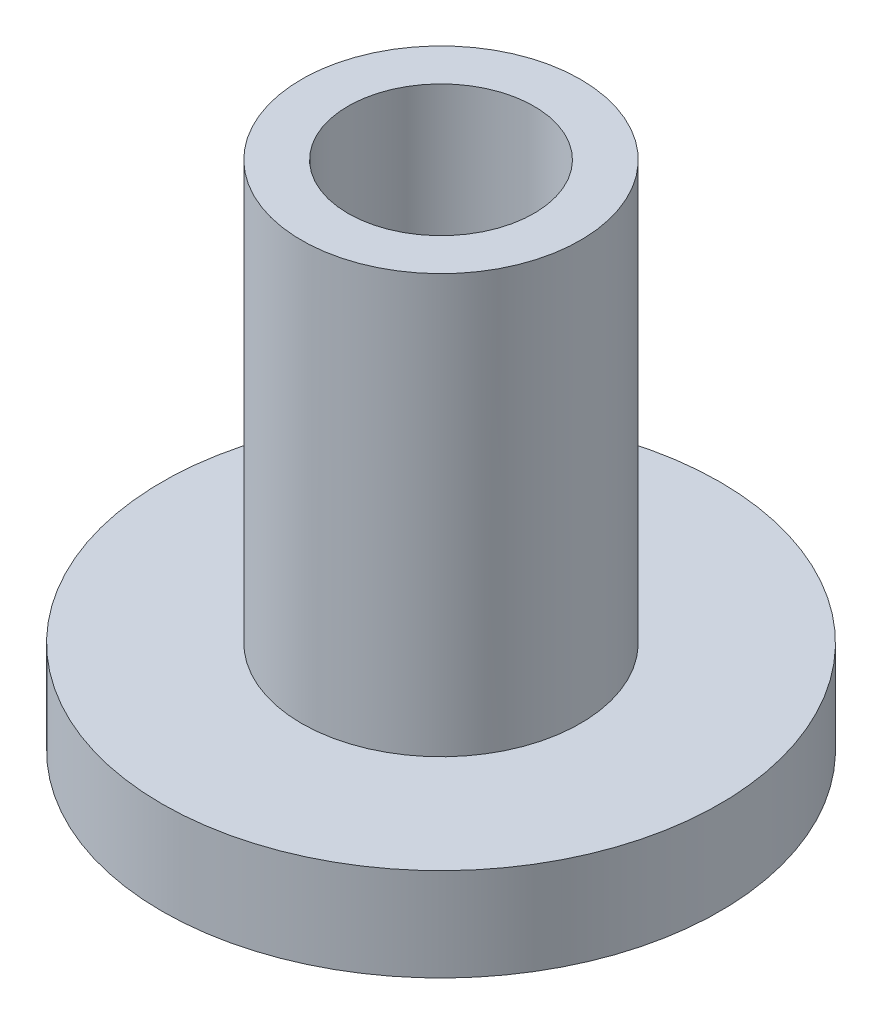
ISO-10303-21;
HEADER;
FILE_DESCRIPTION(('STEP AP214'),'2;1');
FILE_NAME('part.step','',(''),(''),'','','');
FILE_SCHEMA(('AUTOMOTIVE_DESIGN { 1 0 10303 214 1 1 1 1 }'));
ENDSEC;
DATA;
#1=APPLICATION_CONTEXT('core data for automotive mechanical design processes');
#2=APPLICATION_PROTOCOL_DEFINITION('international standard','automotive_design',2000,#1);
#3=PRODUCT_CONTEXT('',#1,'mechanical');
#4=PRODUCT('Part','Part','',(#3));
#5=PRODUCT_RELATED_PRODUCT_CATEGORY('part','',(#4));
#6=PRODUCT_DEFINITION_FORMATION('','',#4);
#7=PRODUCT_DEFINITION_CONTEXT('part definition',#1,'design');
#8=PRODUCT_DEFINITION('design','',#6,#7);
#9=PRODUCT_DEFINITION_SHAPE('','',#8);
#10=(LENGTH_UNIT() NAMED_UNIT(*) SI_UNIT(.MILLI.,.METRE.));
#11=(NAMED_UNIT(*) PLANE_ANGLE_UNIT() SI_UNIT($,.RADIAN.));
#12=(NAMED_UNIT(*) SI_UNIT($,.STERADIAN.) SOLID_ANGLE_UNIT());
#13=UNCERTAINTY_MEASURE_WITH_UNIT(LENGTH_MEASURE(1.E-05),#10,'distance_accuracy_value','');
#14=(GEOMETRIC_REPRESENTATION_CONTEXT(3) GLOBAL_UNCERTAINTY_ASSIGNED_CONTEXT((#13)) GLOBAL_UNIT_ASSIGNED_CONTEXT((#10,
#11,#12)) REPRESENTATION_CONTEXT('',''));
#15=CARTESIAN_POINT('',(0.,0.,0.));
#16=DIRECTION('',(0.,0.,1.));
#17=DIRECTION('',(1.,0.,0.));
#18=AXIS2_PLACEMENT_3D('',#15,#16,#17);
#19=CARTESIAN_POINT('',(0.,12.7,0.));
#20=DIRECTION('',(0.,-1.,0.));
#21=DIRECTION('',(0.,0.,-1.));
#22=AXIS2_PLACEMENT_3D('',#19,#20,#21);
#23=CYLINDRICAL_SURFACE('',#22,38.1);
#24=CARTESIAN_POINT('',(0.,12.7,0.));
#25=DIRECTION('',(0.,1.,0.));
#26=DIRECTION('',(0.,0.,1.));
#27=AXIS2_PLACEMENT_3D('',#24,#25,#26);
#28=CIRCLE('',#27,38.1);
#29=CARTESIAN_POINT('',(0.,12.7,38.1));
#30=VERTEX_POINT('',#29);
#31=EDGE_CURVE('E10',#30,#30,#28,.T.);
#32=ORIENTED_EDGE('',*,*,#31,.F.);
#33=EDGE_LOOP('',(#32));
#34=FACE_BOUND('',#33,.T.);
#35=CARTESIAN_POINT('',(0.,0.,0.));
#36=DIRECTION('',(0.,1.,0.));
#37=DIRECTION('',(0.,0.,1.));
#38=AXIS2_PLACEMENT_3D('',#35,#36,#37);
#39=CIRCLE('',#38,38.1);
#40=CARTESIAN_POINT('',(0.,0.,38.1));
#41=VERTEX_POINT('',#40);
#42=EDGE_CURVE('E36',#41,#41,#39,.T.);
#43=ORIENTED_EDGE('',*,*,#42,.T.);
#44=EDGE_LOOP('',(#43));
#45=FACE_BOUND('',#44,.T.);
#46=ADVANCED_FACE('F33',(#34,#45),#23,.T.);
#47=CARTESIAN_POINT('',(0.,12.7,0.));
#48=DIRECTION('',(0.,1.,0.));
#49=DIRECTION('',(0.,0.,1.));
#50=AXIS2_PLACEMENT_3D('',#47,#48,#49);
#51=PLANE('',#50);
#52=CARTESIAN_POINT('',(0.,12.7,0.));
#53=DIRECTION('',(0.,1.,0.));
#54=DIRECTION('',(0.,0.,1.));
#55=AXIS2_PLACEMENT_3D('',#52,#53,#54);
#56=CIRCLE('',#55,19.05);
#57=CARTESIAN_POINT('',(0.,12.7,19.05));
#58=VERTEX_POINT('',#57);
#59=EDGE_CURVE('E40',#58,#58,#56,.T.);
#60=ORIENTED_EDGE('',*,*,#59,.F.);
#61=EDGE_LOOP('',(#60));
#62=FACE_BOUND('',#61,.T.);
#63=ORIENTED_EDGE('',*,*,#31,.T.);
#64=EDGE_LOOP('',(#63));
#65=FACE_BOUND('',#64,.T.);
#66=ADVANCED_FACE('F78',(#62,#65),#51,.T.);
#67=CARTESIAN_POINT('',(0.,0.,0.));
#68=DIRECTION('',(0.,1.,0.));
#69=DIRECTION('',(0.,0.,1.));
#70=AXIS2_PLACEMENT_3D('',#67,#68,#69);
#71=PLANE('',#70);
#72=CARTESIAN_POINT('',(0.,0.,0.));
#73=DIRECTION('',(0.,1.,0.));
#74=DIRECTION('',(0.,0.,1.));
#75=AXIS2_PLACEMENT_3D('',#72,#73,#74);
#76=CIRCLE('',#75,12.7);
#77=CARTESIAN_POINT('',(0.,0.,12.7));
#78=VERTEX_POINT('',#77);
#79=EDGE_CURVE('E49',#78,#78,#76,.T.);
#80=ORIENTED_EDGE('',*,*,#79,.T.);
#81=EDGE_LOOP('',(#80));
#82=FACE_BOUND('',#81,.T.);
#83=ORIENTED_EDGE('',*,*,#42,.F.);
#84=EDGE_LOOP('',(#83));
#85=FACE_BOUND('',#84,.T.);
#86=ADVANCED_FACE('F56',(#82,#85),#71,.F.);
#87=CARTESIAN_POINT('',(0.,69.85,0.));
#88=DIRECTION('',(0.,-1.,0.));
#89=DIRECTION('',(0.,0.,-1.));
#90=AXIS2_PLACEMENT_3D('',#87,#88,#89);
#91=CYLINDRICAL_SURFACE('',#90,19.05);
#92=ORIENTED_EDGE('',*,*,#59,.T.);
#93=EDGE_LOOP('',(#92));
#94=FACE_BOUND('',#93,.T.);
#95=CARTESIAN_POINT('',(0.,69.85,0.));
#96=DIRECTION('',(0.,-1.,0.));
#97=DIRECTION('',(0.,0.,-1.));
#98=AXIS2_PLACEMENT_3D('',#95,#96,#97);
#99=CIRCLE('',#98,19.05);
#100=CARTESIAN_POINT('',(0.,69.85,-19.05));
#101=VERTEX_POINT('',#100);
#102=EDGE_CURVE('E46',#101,#101,#99,.T.);
#103=ORIENTED_EDGE('',*,*,#102,.T.);
#104=EDGE_LOOP('',(#103));
#105=FACE_BOUND('',#104,.T.);
#106=ADVANCED_FACE('F68',(#94,#105),#91,.T.);
#107=CARTESIAN_POINT('',(0.,69.85,0.));
#108=DIRECTION('',(0.,-1.,0.));
#109=DIRECTION('',(0.,0.,-1.));
#110=AXIS2_PLACEMENT_3D('',#107,#108,#109);
#111=PLANE('',#110);
#112=CARTESIAN_POINT('',(0.,69.85,0.));
#113=DIRECTION('',(0.,1.,0.));
#114=DIRECTION('',(0.,0.,1.));
#115=AXIS2_PLACEMENT_3D('',#112,#113,#114);
#116=CIRCLE('',#115,12.7);
#117=CARTESIAN_POINT('',(0.,69.85,12.7));
#118=VERTEX_POINT('',#117);
#119=EDGE_CURVE('E50',#118,#118,#116,.T.);
#120=ORIENTED_EDGE('',*,*,#119,.F.);
#121=EDGE_LOOP('',(#120));
#122=FACE_BOUND('',#121,.T.);
#123=ORIENTED_EDGE('',*,*,#102,.F.);
#124=EDGE_LOOP('',(#123));
#125=FACE_BOUND('',#124,.T.);
#126=ADVANCED_FACE('F62',(#122,#125),#111,.F.);
#127=CARTESIAN_POINT('',(0.,0.,0.));
#128=DIRECTION('',(0.,1.,0.));
#129=DIRECTION('',(0.,0.,1.));
#130=AXIS2_PLACEMENT_3D('',#127,#128,#129);
#131=CYLINDRICAL_SURFACE('',#130,12.7);
#132=ORIENTED_EDGE('',*,*,#79,.F.);
#133=EDGE_LOOP('',(#132));
#134=FACE_BOUND('',#133,.T.);
#135=ORIENTED_EDGE('',*,*,#119,.T.);
#136=EDGE_LOOP('',(#135));
#137=FACE_BOUND('',#136,.T.);
#138=ADVANCED_FACE('F59',(#134,#137),#131,.F.);
#139=CLOSED_SHELL('',(#46,#66,#86,#106,#126,#138));
#140=MANIFOLD_SOLID_BREP('B2',#139);
#141=ADVANCED_BREP_SHAPE_REPRESENTATION('',(#18,#140),#14);
#142=SHAPE_DEFINITION_REPRESENTATION(#9,#141);
ENDSEC;
END-ISO-10303-21;
